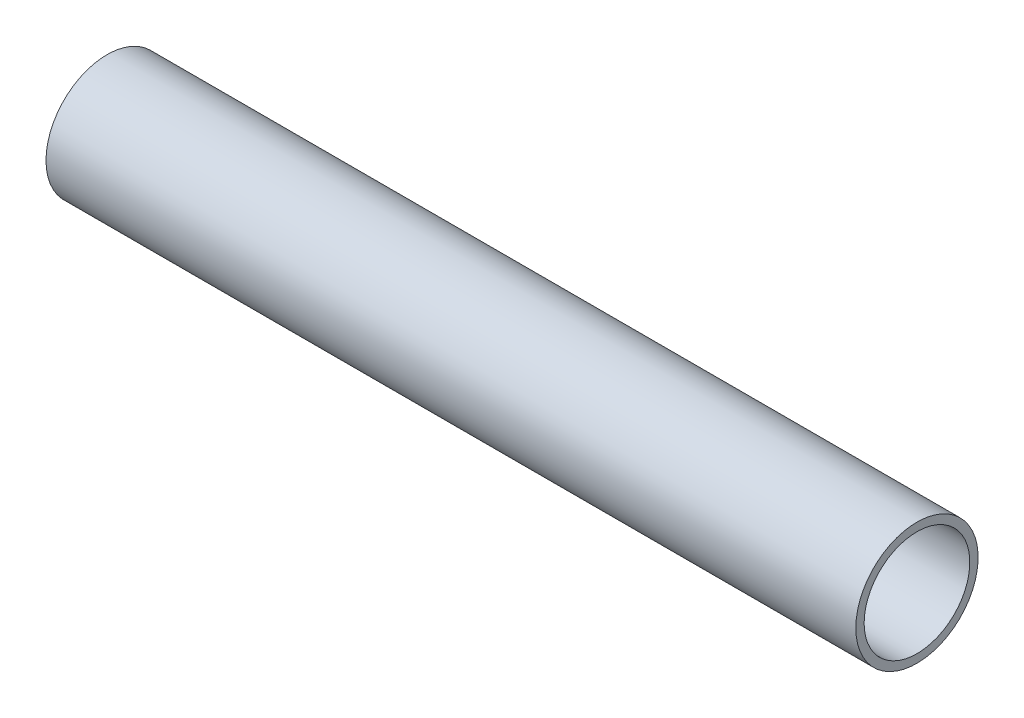
ISO-10303-21;
HEADER;
FILE_DESCRIPTION(('STEP AP214'),'2;1');
FILE_NAME('part.step','',(''),(''),'','','');
FILE_SCHEMA(('AUTOMOTIVE_DESIGN { 1 0 10303 214 1 1 1 1 }'));
ENDSEC;
DATA;
#1=APPLICATION_CONTEXT('core data for automotive mechanical design processes');
#2=APPLICATION_PROTOCOL_DEFINITION('international standard','automotive_design',2000,#1);
#3=PRODUCT_CONTEXT('',#1,'mechanical');
#4=PRODUCT('Part','Part','',(#3));
#5=PRODUCT_RELATED_PRODUCT_CATEGORY('part','',(#4));
#6=PRODUCT_DEFINITION_FORMATION('','',#4);
#7=PRODUCT_DEFINITION_CONTEXT('part definition',#1,'design');
#8=PRODUCT_DEFINITION('design','',#6,#7);
#9=PRODUCT_DEFINITION_SHAPE('','',#8);
#10=(LENGTH_UNIT() NAMED_UNIT(*) SI_UNIT(.MILLI.,.METRE.));
#11=(NAMED_UNIT(*) PLANE_ANGLE_UNIT() SI_UNIT($,.RADIAN.));
#12=(NAMED_UNIT(*) SI_UNIT($,.STERADIAN.) SOLID_ANGLE_UNIT());
#13=UNCERTAINTY_MEASURE_WITH_UNIT(LENGTH_MEASURE(1.E-05),#10,'distance_accuracy_value','');
#14=(GEOMETRIC_REPRESENTATION_CONTEXT(3) GLOBAL_UNCERTAINTY_ASSIGNED_CONTEXT((#13)) GLOBAL_UNIT_ASSIGNED_CONTEXT((#10,
#11,#12)) REPRESENTATION_CONTEXT('',''));
#15=CARTESIAN_POINT('',(0.,0.,0.));
#16=DIRECTION('',(0.,0.,1.));
#17=DIRECTION('',(1.,0.,0.));
#18=AXIS2_PLACEMENT_3D('',#15,#16,#17);
#19=CARTESIAN_POINT('',(5.,22.05,0.));
#20=DIRECTION('',(1.,0.,0.));
#21=DIRECTION('',(0.,0.,-1.));
#22=AXIS2_PLACEMENT_3D('',#19,#20,#21);
#23=PLANE('',#22);
#24=CARTESIAN_POINT('',(5.,0.,0.));
#25=DIRECTION('',(-1.,0.,0.));
#26=DIRECTION('',(0.,0.,1.));
#27=AXIS2_PLACEMENT_3D('',#24,#25,#26);
#28=CIRCLE('',#27,19.05);
#29=CARTESIAN_POINT('',(5.,0.,19.05));
#30=VERTEX_POINT('',#29);
#31=EDGE_CURVE('E10',#30,#30,#28,.T.);
#32=ORIENTED_EDGE('',*,*,#31,.F.);
#33=EDGE_LOOP('',(#32));
#34=FACE_BOUND('',#33,.T.);
#35=CARTESIAN_POINT('',(5.,0.,0.));
#36=DIRECTION('',(-1.,0.,0.));
#37=DIRECTION('',(0.,0.,1.));
#38=AXIS2_PLACEMENT_3D('',#35,#36,#37);
#39=CIRCLE('',#38,22.05);
#40=CARTESIAN_POINT('',(5.,0.,22.05));
#41=VERTEX_POINT('',#40);
#42=EDGE_CURVE('E47',#41,#41,#39,.T.);
#43=ORIENTED_EDGE('',*,*,#42,.T.);
#44=EDGE_LOOP('',(#43));
#45=FACE_BOUND('',#44,.T.);
#46=ADVANCED_FACE('F33',(#34,#45),#23,.F.);
#47=CARTESIAN_POINT('',(-5.5,0.,0.));
#48=DIRECTION('',(-1.,0.,0.));
#49=DIRECTION('',(0.,0.,1.));
#50=AXIS2_PLACEMENT_3D('',#47,#48,#49);
#51=CYLINDRICAL_SURFACE('',#50,19.05);
#52=CARTESIAN_POINT('',(297.,0.,0.));
#53=DIRECTION('',(-1.,0.,0.));
#54=DIRECTION('',(0.,0.,1.));
#55=AXIS2_PLACEMENT_3D('',#52,#53,#54);
#56=CIRCLE('',#55,19.05);
#57=CARTESIAN_POINT('',(297.,0.,19.05));
#58=VERTEX_POINT('',#57);
#59=EDGE_CURVE('E39',#58,#58,#56,.T.);
#60=ORIENTED_EDGE('',*,*,#59,.F.);
#61=EDGE_LOOP('',(#60));
#62=FACE_BOUND('',#61,.T.);
#63=ORIENTED_EDGE('',*,*,#31,.T.);
#64=EDGE_LOOP('',(#63));
#65=FACE_BOUND('',#64,.T.);
#66=ADVANCED_FACE('F62',(#62,#65),#51,.F.);
#67=CARTESIAN_POINT('',(297.,22.05,0.));
#68=DIRECTION('',(-1.,0.,0.));
#69=DIRECTION('',(0.,0.,1.));
#70=AXIS2_PLACEMENT_3D('',#67,#68,#69);
#71=PLANE('',#70);
#72=CARTESIAN_POINT('',(297.,0.,0.));
#73=DIRECTION('',(-1.,0.,0.));
#74=DIRECTION('',(0.,0.,1.));
#75=AXIS2_PLACEMENT_3D('',#72,#73,#74);
#76=CIRCLE('',#75,22.05);
#77=CARTESIAN_POINT('',(297.,0.,22.05));
#78=VERTEX_POINT('',#77);
#79=EDGE_CURVE('E43',#78,#78,#76,.T.);
#80=ORIENTED_EDGE('',*,*,#79,.F.);
#81=EDGE_LOOP('',(#80));
#82=FACE_BOUND('',#81,.T.);
#83=ORIENTED_EDGE('',*,*,#59,.T.);
#84=EDGE_LOOP('',(#83));
#85=FACE_BOUND('',#84,.T.);
#86=ADVANCED_FACE('F57',(#82,#85),#71,.F.);
#87=CARTESIAN_POINT('',(-5.5,0.,0.));
#88=DIRECTION('',(-1.,0.,0.));
#89=DIRECTION('',(0.,0.,1.));
#90=AXIS2_PLACEMENT_3D('',#87,#88,#89);
#91=CYLINDRICAL_SURFACE('',#90,22.05);
#92=ORIENTED_EDGE('',*,*,#42,.F.);
#93=EDGE_LOOP('',(#92));
#94=FACE_BOUND('',#93,.T.);
#95=ORIENTED_EDGE('',*,*,#79,.T.);
#96=EDGE_LOOP('',(#95));
#97=FACE_BOUND('',#96,.T.);
#98=ADVANCED_FACE('F54',(#94,#97),#91,.T.);
#99=CLOSED_SHELL('',(#46,#66,#86,#98));
#100=MANIFOLD_SOLID_BREP('B2',#99);
#101=ADVANCED_BREP_SHAPE_REPRESENTATION('',(#18,#100),#14);
#102=SHAPE_DEFINITION_REPRESENTATION(#9,#101);
ENDSEC;
END-ISO-10303-21;
